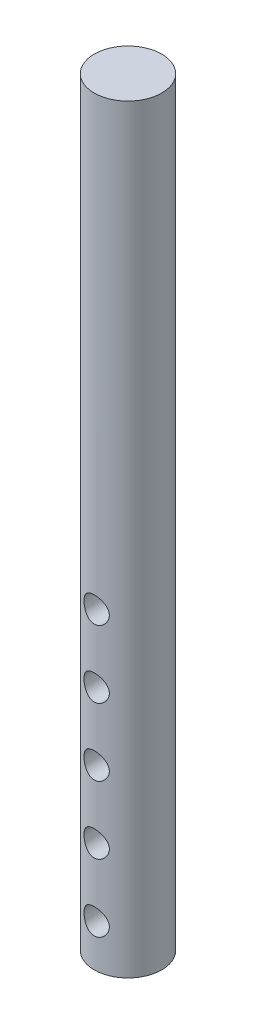
ISO-10303-21;
HEADER;
FILE_DESCRIPTION(('STEP AP214'),'2;1');
FILE_NAME('part.step','',(''),(''),'','','');
FILE_SCHEMA(('AUTOMOTIVE_DESIGN { 1 0 10303 214 1 1 1 1 }'));
ENDSEC;
DATA;
#1=APPLICATION_CONTEXT('core data for automotive mechanical design processes');
#2=APPLICATION_PROTOCOL_DEFINITION('international standard','automotive_design',2000,#1);
#3=PRODUCT_CONTEXT('',#1,'mechanical');
#4=PRODUCT('Part','Part','',(#3));
#5=PRODUCT_RELATED_PRODUCT_CATEGORY('part','',(#4));
#6=PRODUCT_DEFINITION_FORMATION('','',#4);
#7=PRODUCT_DEFINITION_CONTEXT('part definition',#1,'design');
#8=PRODUCT_DEFINITION('design','',#6,#7);
#9=PRODUCT_DEFINITION_SHAPE('','',#8);
#10=(LENGTH_UNIT() NAMED_UNIT(*) SI_UNIT(.MILLI.,.METRE.));
#11=(NAMED_UNIT(*) PLANE_ANGLE_UNIT() SI_UNIT($,.RADIAN.));
#12=(NAMED_UNIT(*) SI_UNIT($,.STERADIAN.) SOLID_ANGLE_UNIT());
#13=UNCERTAINTY_MEASURE_WITH_UNIT(LENGTH_MEASURE(1.E-05),#10,'distance_accuracy_value','');
#14=(GEOMETRIC_REPRESENTATION_CONTEXT(3) GLOBAL_UNCERTAINTY_ASSIGNED_CONTEXT((#13)) GLOBAL_UNIT_ASSIGNED_CONTEXT((#10,
#11,#12)) REPRESENTATION_CONTEXT('',''));
#15=CARTESIAN_POINT('',(0.,0.,0.));
#16=DIRECTION('',(0.,0.,1.));
#17=DIRECTION('',(1.,0.,0.));
#18=AXIS2_PLACEMENT_3D('',#15,#16,#17);
#19=CARTESIAN_POINT('',(-2.91025939558845E-06,71.2591222864222,0.0183221084520018));
#20=DIRECTION('',(0.,-1.,0.));
#21=DIRECTION('',(0.,0.,-1.));
#22=AXIS2_PLACEMENT_3D('',#19,#20,#21);
#23=CYLINDRICAL_SURFACE('',#22,3.81);
#24=CARTESIAN_POINT('',(1.42874708974061,5.53662228642216,3.55028663793131));
#25=CARTESIAN_POINT('',(1.4287499863513,5.45946265817811,3.550283935489));
#26=CARTESIAN_POINT('',(1.42247580639948,5.38232212273745,3.55284253724739));
#27=CARTESIAN_POINT('',(1.39765927944494,5.23036678744734,3.56272852583181));
#28=CARTESIAN_POINT('',(1.37911729987094,5.15555191801291,3.57005576983374));
#29=CARTESIAN_POINT('',(1.33054107848133,5.01048474496028,3.58853480812757));
#30=CARTESIAN_POINT('',(1.30053437245258,4.940221977462,3.5996774320992));
#31=CARTESIAN_POINT('',(1.22997802521481,4.80570055470221,3.62451696176985));
#32=CARTESIAN_POINT('',(1.18942521724585,4.74144371077806,3.63821463434325));
#33=CARTESIAN_POINT('',(1.09676903932951,4.61756426460142,3.66738365714291));
#34=CARTESIAN_POINT('',(1.04422647079735,4.55828236195016,3.68290719027432));
#35=CARTESIAN_POINT('',(0.93001412713004,4.44913130544757,3.71354348318891));
#36=CARTESIAN_POINT('',(0.8683424100601,4.39926415943305,3.72865615476283));
#37=CARTESIAN_POINT('',(0.735036248797277,4.30871690096059,3.75738823269767));
#38=CARTESIAN_POINT('',(0.663134207270584,4.26840713675531,3.77093932910589));
#39=CARTESIAN_POINT('',(0.51297146253751,4.20059704459218,3.7943941344029));
#40=CARTESIAN_POINT('',(0.434712975704805,4.1730922740998,3.80429910801899));
#41=CARTESIAN_POINT('',(0.277640687687794,4.13286789069684,3.81897519836226));
#42=CARTESIAN_POINT('',(0.198996435151332,4.11956172128512,3.82394932587273));
#43=CARTESIAN_POINT('',(0.0404443962551448,4.10623284252206,3.82893184283013));
#44=CARTESIAN_POINT('',(-0.0394629707817375,4.10620581374034,3.82894184700394));
#45=CARTESIAN_POINT('',(-0.194068635028302,4.11909441421774,3.8241241161866));
#46=CARTESIAN_POINT('',(-0.268829060058611,4.13136979271841,3.81953569597041));
#47=CARTESIAN_POINT('',(-0.415139765389521,4.1674377456745,3.80635055218181));
#48=CARTESIAN_POINT('',(-0.486689817976748,4.19123113570175,3.79775354476938));
#49=CARTESIAN_POINT('',(-0.625784949240595,4.2499571416434,3.77724685977273));
#50=CARTESIAN_POINT('',(-0.69325659641305,4.28504681644032,3.76529079690449));
#51=CARTESIAN_POINT('',(-0.821521404338963,4.3652302587474,3.73927583834779));
#52=CARTESIAN_POINT('',(-0.882312401287425,4.41032725334643,3.72521626481181));
#53=CARTESIAN_POINT('',(-0.999261598937279,4.5123297766069,3.69547245342365));
#54=CARTESIAN_POINT('',(-1.05494061362285,4.56977184107919,3.67974128830299));
#55=CARTESIAN_POINT('',(-1.15605592805737,4.69327211256095,3.64908504610251));
#56=CARTESIAN_POINT('',(-1.20148965535926,4.75933247694594,3.63416017218477));
#57=CARTESIAN_POINT('',(-1.28174036273203,4.9000850791805,3.6065106092927));
#58=CARTESIAN_POINT('',(-1.31629931104808,4.97493636415814,3.59384210830839));
#59=CARTESIAN_POINT('',(-1.37214073406469,5.12999644089428,3.57278958639325));
#60=CARTESIAN_POINT('',(-1.39343059652768,5.21020222386515,3.56440318181209));
#61=CARTESIAN_POINT('',(-1.42103948629398,5.36895939052811,3.55342677199964));
#62=CARTESIAN_POINT('',(-1.42811969929854,5.44735789694534,3.55054248787765));
#63=CARTESIAN_POINT('',(-1.42930427094488,5.60425869871867,3.55006389742778));
#64=CARTESIAN_POINT('',(-1.42341187217747,5.68276096323789,3.55246826916498));
#65=CARTESIAN_POINT('',(-1.39950862203888,5.83373553740118,3.56199721847523));
#66=CARTESIAN_POINT('',(-1.38208629989288,5.906317193238,3.56889231441368));
#67=CARTESIAN_POINT('',(-1.33635826371146,6.04749370376815,3.5863536475686));
#68=CARTESIAN_POINT('',(-1.30805031988917,6.11608773832981,3.5969206368849));
#69=CARTESIAN_POINT('',(-1.24016069418141,6.25020141368975,3.62102232413266));
#70=CARTESIAN_POINT('',(-1.20019620307076,6.31550943718298,3.63465341614892));
#71=CARTESIAN_POINT('',(-1.1105352128995,6.43876264151621,3.66318541460513));
#72=CARTESIAN_POINT('',(-1.06083515196793,6.49670511475212,3.67808678466059));
#73=CARTESIAN_POINT('',(-0.94938570246753,6.60739266189049,3.70862187687108));
#74=CARTESIAN_POINT('',(-0.887072200529622,6.6595754082744,3.72424214157769));
#75=CARTESIAN_POINT('',(-0.754190002104262,6.7528108315511,3.75354966747746));
#76=CARTESIAN_POINT('',(-0.683621278849232,6.79386347235307,3.76723692240251));
#77=CARTESIAN_POINT('',(-0.53627596407811,6.86340340495229,3.79112684728786));
#78=CARTESIAN_POINT('',(-0.459521707753442,6.89193370183461,3.80134141569655));
#79=CARTESIAN_POINT('',(-0.301832908125285,6.93551752061421,3.81717249313924));
#80=CARTESIAN_POINT('',(-0.220900348248608,6.950577375787,3.82279116287891));
#81=CARTESIAN_POINT('',(-0.0622350552326956,6.96610990504613,3.82859268814713));
#82=CARTESIAN_POINT('',(0.0154092713185686,6.96738156903585,3.82907325903661));
#83=CARTESIAN_POINT('',(0.169758103798447,6.95735684705042,3.82532068388486));
#84=CARTESIAN_POINT('',(0.246462721946721,6.94606197685338,3.82108810634457));
#85=CARTESIAN_POINT('',(0.394854296319826,6.91178573037449,3.80852048692792));
#86=CARTESIAN_POINT('',(0.466618011083678,6.88909617607302,3.80028804632762));
#87=CARTESIAN_POINT('',(0.6053255777792,6.83296524867355,3.78058074744193));
#88=CARTESIAN_POINT('',(0.672268514380568,6.79952184027438,3.7691052754222));
#89=CARTESIAN_POINT('',(0.802516608327791,6.72123325523383,3.74346024776021));
#90=CARTESIAN_POINT('',(0.865550555017237,6.67596788633243,3.72919772048859));
#91=CARTESIAN_POINT('',(0.983374613256615,6.57598282816846,3.69972991924539));
#92=CARTESIAN_POINT('',(1.03816176911186,6.52125976424016,3.68452431001211));
#93=CARTESIAN_POINT('',(1.14091315534038,6.40047870103024,3.65390154421764));
#94=CARTESIAN_POINT('',(1.18836466298825,6.33397489337018,3.63851557940275));
#95=CARTESIAN_POINT('',(1.27143894826954,6.19345117065357,3.61018365411165));
#96=CARTESIAN_POINT('',(1.30706049870506,6.11943047686122,3.59723794683934));
#97=CARTESIAN_POINT('',(1.36650966317044,5.96243200029308,3.57497872880436));
#98=CARTESIAN_POINT('',(1.38975176735857,5.87920380231968,3.56584933479744));
#99=CARTESIAN_POINT('',(1.42086378751842,5.70951506488427,3.5535067545054));
#100=CARTESIAN_POINT('',(1.42874384495002,5.62305669631589,3.55028966521399));
#101=CARTESIAN_POINT('',(1.42874708974061,5.53662228642216,3.55028663793131));
#102=B_SPLINE_CURVE_WITH_KNOTS('',3,(#24,#25,#26,#27,#28,#29,#30,#31,#32,#33,#34,#35,#36,#37,
#38,#39,#40,#41,#42,#43,#44,#45,#46,#47,#48,#49,#50,#51,#52,#53,#54,#55,#56,#57,#58,#59,#60,#61,
#62,#63,#64,#65,#66,#67,#68,#69,#70,#71,#72,#73,#74,#75,#76,#77,#78,#79,#80,#81,#82,#83,#84,#85,
#86,#87,#88,#89,#90,#91,#92,#93,#94,#95,#96,#97,#98,#99,#100,#101),.UNSPECIFIED.,.T.,.F.,(4,2,2,
2,2,2,2,2,2,2,2,2,2,2,2,2,2,2,2,2,2,2,2,2,2,2,2,2,2,2,2,2,2,2,2,2,2,2,4),(0.,0.231157025698902,
0.462307128405409,0.692905513561072,0.923573222397995,1.16466606412074,1.40581026453891,
1.65515993709941,1.90442303628217,2.14293467611419,2.38136873298127,2.60800665345043,
2.83466062413327,3.06461284978161,3.29463933681599,3.53812483000246,3.78167139105536,
4.03062369120951,4.27943725932789,4.51452288997812,4.74954976607912,4.97342013246609,
5.19733638041624,5.42964586858045,5.66204050914203,5.90916728686427,6.15629486591794,
6.40256697217885,6.64872322996021,6.88053348823814,7.11231578854304,7.33844360988706,
7.56461425395971,7.8002922830233,8.03605458027454,8.2842601606383,8.53249148093391,
8.79160527874557,9.05054796112708),.UNSPECIFIED.);
#103=CARTESIAN_POINT('',(1.42874708974061,5.53662228642216,3.55028663793131));
#104=VERTEX_POINT('',#103);
#105=EDGE_CURVE('E10',#104,#104,#102,.T.);
#106=ORIENTED_EDGE('',*,*,#105,.T.);
#107=EDGE_LOOP('',(#106));
#108=FACE_BOUND('',#107,.T.);
#109=CARTESIAN_POINT('',(1.42874708974061,-2.08337771357784,3.55028663793131));
#110=CARTESIAN_POINT('',(1.4287499863513,-2.16053734182189,3.550283935489));
#111=CARTESIAN_POINT('',(1.42247580639948,-2.23767787726255,3.55284253724739));
#112=CARTESIAN_POINT('',(1.39765927944494,-2.38963321255266,3.56272852583181));
#113=CARTESIAN_POINT('',(1.37911729987095,-2.46444808198709,3.57005576983374));
#114=CARTESIAN_POINT('',(1.33054107848133,-2.60951525503972,3.58853480812757));
#115=CARTESIAN_POINT('',(1.30053437245258,-2.679778022538,3.5996774320992));
#116=CARTESIAN_POINT('',(1.22997802521481,-2.81429944529778,3.62451696176985));
#117=CARTESIAN_POINT('',(1.18942521724586,-2.87855628922194,3.63821463434325));
#118=CARTESIAN_POINT('',(1.09676903932951,-3.00243573539857,3.66738365714291));
#119=CARTESIAN_POINT('',(1.04422647079736,-3.06171763804984,3.68290719027432));
#120=CARTESIAN_POINT('',(0.930014127130041,-3.17086869455243,3.71354348318891));
#121=CARTESIAN_POINT('',(0.868342410060101,-3.22073584056696,3.72865615476283));
#122=CARTESIAN_POINT('',(0.735036248797278,-3.31128309903941,3.75738823269767));
#123=CARTESIAN_POINT('',(0.663134207270585,-3.35159286324469,3.77093932910589));
#124=CARTESIAN_POINT('',(0.512971462537512,-3.41940295540782,3.7943941344029));
#125=CARTESIAN_POINT('',(0.434712975704807,-3.4469077259002,3.80429910801899));
#126=CARTESIAN_POINT('',(0.277640687687796,-3.48713210930316,3.81897519836226));
#127=CARTESIAN_POINT('',(0.198996435151334,-3.50043827871487,3.82394932587273));
#128=CARTESIAN_POINT('',(0.0404443962551471,-3.51376715747794,3.82893184283013));
#129=CARTESIAN_POINT('',(-0.0394629707817352,-3.51379418625966,3.82894184700394));
#130=CARTESIAN_POINT('',(-0.1940686350283,-3.50090558578226,3.8241241161866));
#131=CARTESIAN_POINT('',(-0.268829060058609,-3.48863020728159,3.81953569597041));
#132=CARTESIAN_POINT('',(-0.41513976538952,-3.4525622543255,3.80635055218181));
#133=CARTESIAN_POINT('',(-0.486689817976746,-3.42876886429825,3.79775354476938));
#134=CARTESIAN_POINT('',(-0.625784949240594,-3.37004285835659,3.77724685977273));
#135=CARTESIAN_POINT('',(-0.693256596413049,-3.33495318355968,3.76529079690449));
#136=CARTESIAN_POINT('',(-0.821521404338963,-3.2547697412526,3.73927583834779));
#137=CARTESIAN_POINT('',(-0.882312401287425,-3.20967274665357,3.72521626481181));
#138=CARTESIAN_POINT('',(-0.999261598937278,-3.1076702233931,3.69547245342365));
#139=CARTESIAN_POINT('',(-1.05494061362285,-3.05022815892081,3.67974128830299));
#140=CARTESIAN_POINT('',(-1.15605592805737,-2.92672788743905,3.64908504610251));
#141=CARTESIAN_POINT('',(-1.20148965535926,-2.86066752305406,3.63416017218477));
#142=CARTESIAN_POINT('',(-1.28174036273203,-2.7199149208195,3.6065106092927));
#143=CARTESIAN_POINT('',(-1.31629931104807,-2.64506363584186,3.59384210830839));
#144=CARTESIAN_POINT('',(-1.37214073406468,-2.49000355910573,3.57278958639325));
#145=CARTESIAN_POINT('',(-1.39343059652768,-2.40979777613485,3.56440318181209));
#146=CARTESIAN_POINT('',(-1.42103948629398,-2.25104060947189,3.55342677199964));
#147=CARTESIAN_POINT('',(-1.42811969929854,-2.17264210305466,3.55054248787765));
#148=CARTESIAN_POINT('',(-1.42930427094488,-2.01574130128133,3.55006389742778));
#149=CARTESIAN_POINT('',(-1.42341187217747,-1.93723903676211,3.55246826916498));
#150=CARTESIAN_POINT('',(-1.39950862203888,-1.78626446259882,3.56199721847523));
#151=CARTESIAN_POINT('',(-1.38208629989287,-1.713682806762,3.56889231441368));
#152=CARTESIAN_POINT('',(-1.33635826371146,-1.57250629623185,3.5863536475686));
#153=CARTESIAN_POINT('',(-1.30805031988917,-1.50391226167019,3.5969206368849));
#154=CARTESIAN_POINT('',(-1.24016069418141,-1.36979858631025,3.62102232413266));
#155=CARTESIAN_POINT('',(-1.20019620307076,-1.30449056281702,3.63465341614892));
#156=CARTESIAN_POINT('',(-1.1105352128995,-1.18123735848379,3.66318541460513));
#157=CARTESIAN_POINT('',(-1.06083515196793,-1.12329488524788,3.67808678466059));
#158=CARTESIAN_POINT('',(-0.949385702467529,-1.01260733810951,3.70862187687108));
#159=CARTESIAN_POINT('',(-0.887072200529622,-0.960424591725603,3.72424214157769));
#160=CARTESIAN_POINT('',(-0.754190002104262,-0.867189168448899,3.75354966747746));
#161=CARTESIAN_POINT('',(-0.683621278849232,-0.826136527646928,3.76723692240251));
#162=CARTESIAN_POINT('',(-0.536275964078111,-0.756596595047709,3.79112684728786));
#163=CARTESIAN_POINT('',(-0.459521707753443,-0.728066298165385,3.80134141569655));
#164=CARTESIAN_POINT('',(-0.301832908125286,-0.684482479385792,3.81717249313924));
#165=CARTESIAN_POINT('',(-0.220900348248608,-0.669422624213004,3.82279116287891));
#166=CARTESIAN_POINT('',(-0.0622350552326949,-0.653890094953869,3.82859268814713));
#167=CARTESIAN_POINT('',(0.0154092713185693,-0.652618430964151,3.82907325903661));
#168=CARTESIAN_POINT('',(0.169758103798448,-0.662643152949577,3.82532068388486));
#169=CARTESIAN_POINT('',(0.246462721946722,-0.673938023146617,3.82108810634457));
#170=CARTESIAN_POINT('',(0.394854296319827,-0.708214269625513,3.80852048692792));
#171=CARTESIAN_POINT('',(0.466618011083679,-0.730903823926974,3.80028804632762));
#172=CARTESIAN_POINT('',(0.6053255777792,-0.787034751326445,3.78058074744193));
#173=CARTESIAN_POINT('',(0.672268514380568,-0.820478159725617,3.7691052754222));
#174=CARTESIAN_POINT('',(0.802516608327792,-0.898766744766172,3.74346024776021));
#175=CARTESIAN_POINT('',(0.865550555017239,-0.944032113667565,3.72919772048859));
#176=CARTESIAN_POINT('',(0.983374613256616,-1.04401717183153,3.69972991924539));
#177=CARTESIAN_POINT('',(1.03816176911186,-1.09874023575984,3.68452431001211));
#178=CARTESIAN_POINT('',(1.14091315534038,-1.21952129896976,3.65390154421764));
#179=CARTESIAN_POINT('',(1.18836466298825,-1.28602510662982,3.63851557940275));
#180=CARTESIAN_POINT('',(1.27143894826955,-1.42654882934643,3.61018365411165));
#181=CARTESIAN_POINT('',(1.30706049870506,-1.50056952313878,3.59723794683934));
#182=CARTESIAN_POINT('',(1.36650966317044,-1.65756799970692,3.57497872880436));
#183=CARTESIAN_POINT('',(1.38975176735857,-1.74079619768032,3.56584933479744));
#184=CARTESIAN_POINT('',(1.42086378751842,-1.91048493511573,3.5535067545054));
#185=CARTESIAN_POINT('',(1.42874384495002,-1.99694330368411,3.55028966521399));
#186=CARTESIAN_POINT('',(1.42874708974061,-2.08337771357784,3.55028663793131));
#187=B_SPLINE_CURVE_WITH_KNOTS('',3,(#109,#110,#111,#112,#113,#114,#115,#116,#117,#118,#119,
#120,#121,#122,#123,#124,#125,#126,#127,#128,#129,#130,#131,#132,#133,#134,#135,#136,#137,#138,
#139,#140,#141,#142,#143,#144,#145,#146,#147,#148,#149,#150,#151,#152,#153,#154,#155,#156,#157,
#158,#159,#160,#161,#162,#163,#164,#165,#166,#167,#168,#169,#170,#171,#172,#173,#174,#175,#176,
#177,#178,#179,#180,#181,#182,#183,#184,#185,#186),.UNSPECIFIED.,.T.,.F.,(4,2,2,2,2,2,2,2,2,2,2,
2,2,2,2,2,2,2,2,2,2,2,2,2,2,2,2,2,2,2,2,2,2,2,2,2,2,2,4),(0.,0.231157025698902,
0.462307128405409,0.692905513561071,0.923573222397994,1.16466606412074,1.40581026453891,
1.65515993709941,1.90442303628217,2.14293467611419,2.38136873298126,2.60800665345042,
2.83466062413327,3.06461284978161,3.29463933681599,3.53812483000245,3.78167139105536,
4.0306236912095,4.27943725932789,4.51452288997812,4.74954976607912,4.97342013246609,
5.19733638041624,5.42964586858045,5.66204050914203,5.90916728686427,6.15629486591794,
6.40256697217885,6.64872322996021,6.88053348823814,7.11231578854304,7.33844360988706,
7.56461425395971,7.8002922830233,8.03605458027453,8.2842601606383,8.53249148093391,
8.79160527874557,9.05054796112708),.UNSPECIFIED.);
#188=CARTESIAN_POINT('',(1.42874708974061,-2.08337771357784,3.55028663793131));
#189=VERTEX_POINT('',#188);
#190=EDGE_CURVE('E42',#189,#189,#187,.T.);
#191=ORIENTED_EDGE('',*,*,#190,.T.);
#192=EDGE_LOOP('',(#191));
#193=FACE_BOUND('',#192,.T.);
#194=CARTESIAN_POINT('',(1.42874708974061,20.7766222864222,3.55028663793131));
#195=CARTESIAN_POINT('',(1.4287499863513,20.6994626581781,3.550283935489));
#196=CARTESIAN_POINT('',(1.42247580639948,20.6223221227375,3.55284253724739));
#197=CARTESIAN_POINT('',(1.39765927944494,20.4703667874473,3.56272852583181));
#198=CARTESIAN_POINT('',(1.37911729987094,20.3955519180129,3.57005576983374));
#199=CARTESIAN_POINT('',(1.33054107848133,20.2504847449603,3.58853480812757));
#200=CARTESIAN_POINT('',(1.30053437245258,20.180221977462,3.5996774320992));
#201=CARTESIAN_POINT('',(1.22997802521481,20.0457005547022,3.62451696176985));
#202=CARTESIAN_POINT('',(1.18942521724585,19.9814437107781,3.63821463434325));
#203=CARTESIAN_POINT('',(1.09676903932951,19.8575642646014,3.66738365714291));
#204=CARTESIAN_POINT('',(1.04422647079736,19.7982823619502,3.68290719027432));
#205=CARTESIAN_POINT('',(0.930014127130042,19.6891313054476,3.71354348318891));
#206=CARTESIAN_POINT('',(0.868342410060102,19.6392641594331,3.72865615476282));
#207=CARTESIAN_POINT('',(0.735036248797279,19.5487169009606,3.75738823269767));
#208=CARTESIAN_POINT('',(0.663134207270587,19.5084071367553,3.77093932910589));
#209=CARTESIAN_POINT('',(0.512971462537514,19.4405970445922,3.7943941344029));
#210=CARTESIAN_POINT('',(0.434712975704809,19.4130922740998,3.80429910801899));
#211=CARTESIAN_POINT('',(0.277640687687799,19.3728678906968,3.81897519836226));
#212=CARTESIAN_POINT('',(0.198996435151336,19.3595617212851,3.82394932587273));
#213=CARTESIAN_POINT('',(0.0404443962551484,19.3462328425221,3.82893184283013));
#214=CARTESIAN_POINT('',(-0.0394629707817344,19.3462058137403,3.82894184700394));
#215=CARTESIAN_POINT('',(-0.194068635028299,19.3590944142177,3.8241241161866));
#216=CARTESIAN_POINT('',(-0.268829060058608,19.3713697927184,3.81953569597041));
#217=CARTESIAN_POINT('',(-0.415139765389518,19.4074377456745,3.80635055218181));
#218=CARTESIAN_POINT('',(-0.486689817976746,19.4312311357018,3.79775354476938));
#219=CARTESIAN_POINT('',(-0.625784949240593,19.4899571416434,3.77724685977273));
#220=CARTESIAN_POINT('',(-0.693256596413047,19.5250468164403,3.76529079690449));
#221=CARTESIAN_POINT('',(-0.82152140433896,19.6052302587474,3.73927583834779));
#222=CARTESIAN_POINT('',(-0.882312401287423,19.6503272533464,3.72521626481181));
#223=CARTESIAN_POINT('',(-0.999261598937278,19.7523297766069,3.69547245342365));
#224=CARTESIAN_POINT('',(-1.05494061362285,19.8097718410792,3.67974128830299));
#225=CARTESIAN_POINT('',(-1.15605592805737,19.9332721125609,3.64908504610251));
#226=CARTESIAN_POINT('',(-1.20148965535926,19.9993324769459,3.63416017218477));
#227=CARTESIAN_POINT('',(-1.28174036273203,20.1400850791805,3.6065106092927));
#228=CARTESIAN_POINT('',(-1.31629931104808,20.2149363641581,3.59384210830839));
#229=CARTESIAN_POINT('',(-1.37214073406469,20.3699964408943,3.57278958639325));
#230=CARTESIAN_POINT('',(-1.39343059652768,20.4502022238651,3.56440318181209));
#231=CARTESIAN_POINT('',(-1.42103948629398,20.6089593905281,3.55342677199964));
#232=CARTESIAN_POINT('',(-1.42811969929854,20.6873578969453,3.55054248787764));
#233=CARTESIAN_POINT('',(-1.42930427094488,20.8442586987187,3.55006389742778));
#234=CARTESIAN_POINT('',(-1.42341187217747,20.9227609632379,3.55246826916498));
#235=CARTESIAN_POINT('',(-1.39950862203888,21.0737355374012,3.56199721847523));
#236=CARTESIAN_POINT('',(-1.38208629989288,21.146317193238,3.56889231441368));
#237=CARTESIAN_POINT('',(-1.33635826371146,21.2874937037681,3.5863536475686));
#238=CARTESIAN_POINT('',(-1.30805031988917,21.3560877383298,3.5969206368849));
#239=CARTESIAN_POINT('',(-1.24016069418141,21.4902014136897,3.62102232413266));
#240=CARTESIAN_POINT('',(-1.20019620307076,21.555509437183,3.63465341614892));
#241=CARTESIAN_POINT('',(-1.1105352128995,21.6787626415162,3.66318541460513));
#242=CARTESIAN_POINT('',(-1.06083515196793,21.7367051147521,3.67808678466059));
#243=CARTESIAN_POINT('',(-0.949385702467534,21.8473926618905,3.70862187687108));
#244=CARTESIAN_POINT('',(-0.887072200529627,21.8995754082744,3.72424214157769));
#245=CARTESIAN_POINT('',(-0.754190002104268,21.9928108315511,3.75354966747746));
#246=CARTESIAN_POINT('',(-0.683621278849239,22.0338634723531,3.7672369224025));
#247=CARTESIAN_POINT('',(-0.536275964078118,22.1034034049523,3.79112684728786));
#248=CARTESIAN_POINT('',(-0.459521707753451,22.1319337018346,3.80134141569655));
#249=CARTESIAN_POINT('',(-0.301832908125294,22.1755175206142,3.81717249313924));
#250=CARTESIAN_POINT('',(-0.220900348248615,22.190577375787,3.82279116287891));
#251=CARTESIAN_POINT('',(-0.0622350552327017,22.2061099050461,3.82859268814713));
#252=CARTESIAN_POINT('',(0.0154092713185628,22.2073815690359,3.82907325903661));
#253=CARTESIAN_POINT('',(0.169758103798441,22.1973568470504,3.82532068388486));
#254=CARTESIAN_POINT('',(0.246462721946715,22.1860619768534,3.82108810634457));
#255=CARTESIAN_POINT('',(0.394854296319821,22.1517857303745,3.80852048692792));
#256=CARTESIAN_POINT('',(0.466618011083674,22.129096176073,3.80028804632762));
#257=CARTESIAN_POINT('',(0.605325577779195,22.0729652486736,3.78058074744193));
#258=CARTESIAN_POINT('',(0.672268514380563,22.0395218402744,3.7691052754222));
#259=CARTESIAN_POINT('',(0.802516608327787,21.9612332552338,3.74346024776021));
#260=CARTESIAN_POINT('',(0.865550555017234,21.9159678863324,3.72919772048859));
#261=CARTESIAN_POINT('',(0.983374613256612,21.8159828281685,3.69972991924539));
#262=CARTESIAN_POINT('',(1.03816176911185,21.7612597642402,3.68452431001211));
#263=CARTESIAN_POINT('',(1.14091315534037,21.6404787010302,3.65390154421764));
#264=CARTESIAN_POINT('',(1.18836466298825,21.5739748933702,3.63851557940275));
#265=CARTESIAN_POINT('',(1.27143894826954,21.4334511706536,3.61018365411165));
#266=CARTESIAN_POINT('',(1.30706049870505,21.3594304768612,3.59723794683934));
#267=CARTESIAN_POINT('',(1.36650966317044,21.2024320002931,3.57497872880436));
#268=CARTESIAN_POINT('',(1.38975176735856,21.1192038023197,3.56584933479744));
#269=CARTESIAN_POINT('',(1.42086378751841,20.9495150648843,3.5535067545054));
#270=CARTESIAN_POINT('',(1.42874384495002,20.8630566963159,3.55028966521399));
#271=CARTESIAN_POINT('',(1.42874708974061,20.7766222864222,3.55028663793131));
#272=B_SPLINE_CURVE_WITH_KNOTS('',3,(#194,#195,#196,#197,#198,#199,#200,#201,#202,#203,#204,
#205,#206,#207,#208,#209,#210,#211,#212,#213,#214,#215,#216,#217,#218,#219,#220,#221,#222,#223,
#224,#225,#226,#227,#228,#229,#230,#231,#232,#233,#234,#235,#236,#237,#238,#239,#240,#241,#242,
#243,#244,#245,#246,#247,#248,#249,#250,#251,#252,#253,#254,#255,#256,#257,#258,#259,#260,#261,
#262,#263,#264,#265,#266,#267,#268,#269,#270,#271),.UNSPECIFIED.,.T.,.F.,(4,2,2,2,2,2,2,2,2,2,2,
2,2,2,2,2,2,2,2,2,2,2,2,2,2,2,2,2,2,2,2,2,2,2,2,2,2,2,4),(0.,0.231157025698903,
0.462307128405408,0.692905513561069,0.923573222397987,1.16466606412074,1.40581026453891,
1.65515993709941,1.90442303628216,2.14293467611419,2.38136873298126,2.60800665345042,
2.83466062413327,3.06461284978161,3.29463933681599,3.53812483000245,3.78167139105536,
4.0306236912095,4.27943725932789,4.51452288997812,4.74954976607912,4.97342013246609,
5.19733638041624,5.42964586858045,5.66204050914203,5.90916728686427,6.15629486591794,
6.40256697217885,6.64872322996021,6.88053348823814,7.11231578854304,7.33844360988706,
7.56461425395972,7.8002922830233,8.03605458027454,8.2842601606383,8.53249148093391,
8.79160527874558,9.05054796112708),.UNSPECIFIED.);
#273=CARTESIAN_POINT('',(1.42874708974061,20.7766222864222,3.55028663793131));
#274=VERTEX_POINT('',#273);
#275=EDGE_CURVE('E46',#274,#274,#272,.T.);
#276=ORIENTED_EDGE('',*,*,#275,.T.);
#277=EDGE_LOOP('',(#276));
#278=FACE_BOUND('',#277,.T.);
#279=CARTESIAN_POINT('',(1.42874708974061,-9.70337771357784,3.55028663793131));
#280=CARTESIAN_POINT('',(1.4287499863513,-9.78053734182189,3.550283935489));
#281=CARTESIAN_POINT('',(1.42247580639948,-9.85767787726255,3.55284253724739));
#282=CARTESIAN_POINT('',(1.39765927944495,-10.0096332125527,3.56272852583181));
#283=CARTESIAN_POINT('',(1.37911729987095,-10.0844480819871,3.57005576983374));
#284=CARTESIAN_POINT('',(1.33054107848133,-10.2295152550397,3.58853480812757));
#285=CARTESIAN_POINT('',(1.30053437245258,-10.299778022538,3.5996774320992));
#286=CARTESIAN_POINT('',(1.22997802521481,-10.4342994452978,3.62451696176985));
#287=CARTESIAN_POINT('',(1.18942521724586,-10.4985562892219,3.63821463434325));
#288=CARTESIAN_POINT('',(1.09676903932951,-10.6224357353986,3.66738365714291));
#289=CARTESIAN_POINT('',(1.04422647079736,-10.6817176380498,3.68290719027432));
#290=CARTESIAN_POINT('',(0.930014127130042,-10.7908686945524,3.71354348318891));
#291=CARTESIAN_POINT('',(0.868342410060102,-10.840735840567,3.72865615476282));
#292=CARTESIAN_POINT('',(0.735036248797279,-10.9312830990394,3.75738823269767));
#293=CARTESIAN_POINT('',(0.663134207270587,-10.9715928632447,3.77093932910589));
#294=CARTESIAN_POINT('',(0.512971462537513,-11.0394029554078,3.7943941344029));
#295=CARTESIAN_POINT('',(0.434712975704808,-11.0669077259002,3.80429910801899));
#296=CARTESIAN_POINT('',(0.277640687687797,-11.1071321093032,3.81897519836226));
#297=CARTESIAN_POINT('',(0.198996435151335,-11.1204382787149,3.82394932587273));
#298=CARTESIAN_POINT('',(0.0404443962551486,-11.1337671574779,3.82893184283013));
#299=CARTESIAN_POINT('',(-0.0394629707817336,-11.1337941862597,3.82894184700394));
#300=CARTESIAN_POINT('',(-0.194068635028299,-11.1209055857823,3.8241241161866));
#301=CARTESIAN_POINT('',(-0.268829060058607,-11.1086302072816,3.81953569597041));
#302=CARTESIAN_POINT('',(-0.415139765389518,-11.0725622543255,3.80635055218181));
#303=CARTESIAN_POINT('',(-0.486689817976745,-11.0487688642982,3.79775354476938));
#304=CARTESIAN_POINT('',(-0.625784949240592,-10.9900428583566,3.77724685977273));
#305=CARTESIAN_POINT('',(-0.693256596413048,-10.9549531835597,3.76529079690449));
#306=CARTESIAN_POINT('',(-0.821521404338961,-10.8747697412526,3.73927583834779));
#307=CARTESIAN_POINT('',(-0.882312401287423,-10.8296727466536,3.72521626481181));
#308=CARTESIAN_POINT('',(-0.999261598937277,-10.7276702233931,3.69547245342365));
#309=CARTESIAN_POINT('',(-1.05494061362285,-10.6702281589208,3.67974128830299));
#310=CARTESIAN_POINT('',(-1.15605592805737,-10.5467278874391,3.64908504610251));
#311=CARTESIAN_POINT('',(-1.20148965535926,-10.4806675230541,3.63416017218477));
#312=CARTESIAN_POINT('',(-1.28174036273203,-10.3399149208195,3.6065106092927));
#313=CARTESIAN_POINT('',(-1.31629931104807,-10.2650636358419,3.59384210830839));
#314=CARTESIAN_POINT('',(-1.37214073406468,-10.1100035591057,3.57278958639325));
#315=CARTESIAN_POINT('',(-1.39343059652768,-10.0297977761348,3.56440318181209));
#316=CARTESIAN_POINT('',(-1.42103948629398,-9.87104060947189,3.55342677199964));
#317=CARTESIAN_POINT('',(-1.42811969929854,-9.79264210305467,3.55054248787765));
#318=CARTESIAN_POINT('',(-1.42930427094488,-9.63574130128133,3.55006389742778));
#319=CARTESIAN_POINT('',(-1.42341187217747,-9.55723903676211,3.55246826916498));
#320=CARTESIAN_POINT('',(-1.39950862203888,-9.40626446259883,3.56199721847523));
#321=CARTESIAN_POINT('',(-1.38208629989287,-9.333682806762,3.56889231441368));
#322=CARTESIAN_POINT('',(-1.33635826371146,-9.19250629623186,3.5863536475686));
#323=CARTESIAN_POINT('',(-1.30805031988917,-9.12391226167019,3.5969206368849));
#324=CARTESIAN_POINT('',(-1.24016069418141,-8.98979858631025,3.62102232413266));
#325=CARTESIAN_POINT('',(-1.20019620307076,-8.92449056281702,3.63465341614892));
#326=CARTESIAN_POINT('',(-1.1105352128995,-8.80123735848379,3.66318541460513));
#327=CARTESIAN_POINT('',(-1.06083515196792,-8.74329488524788,3.67808678466059));
#328=CARTESIAN_POINT('',(-0.949385702467528,-8.63260733810951,3.70862187687108));
#329=CARTESIAN_POINT('',(-0.887072200529621,-8.5804245917256,3.72424214157769));
#330=CARTESIAN_POINT('',(-0.754190002104261,-8.4871891684489,3.75354966747746));
#331=CARTESIAN_POINT('',(-0.683621278849232,-8.44613652764693,3.76723692240251));
#332=CARTESIAN_POINT('',(-0.53627596407811,-8.37659659504771,3.79112684728786));
#333=CARTESIAN_POINT('',(-0.459521707753443,-8.34806629816539,3.80134141569655));
#334=CARTESIAN_POINT('',(-0.301832908125286,-8.30448247938579,3.81717249313924));
#335=CARTESIAN_POINT('',(-0.220900348248608,-8.289422624213,3.82279116287891));
#336=CARTESIAN_POINT('',(-0.0622350552326954,-8.27389009495387,3.82859268814713));
#337=CARTESIAN_POINT('',(0.0154092713185692,-8.27261843096415,3.82907325903661));
#338=CARTESIAN_POINT('',(0.169758103798448,-8.28264315294958,3.82532068388485));
#339=CARTESIAN_POINT('',(0.246462721946721,-8.29393802314662,3.82108810634457));
#340=CARTESIAN_POINT('',(0.394854296319827,-8.32821426962551,3.80852048692792));
#341=CARTESIAN_POINT('',(0.466618011083679,-8.35090382392698,3.80028804632762));
#342=CARTESIAN_POINT('',(0.605325577779201,-8.40703475132645,3.78058074744193));
#343=CARTESIAN_POINT('',(0.672268514380568,-8.44047815972562,3.7691052754222));
#344=CARTESIAN_POINT('',(0.802516608327792,-8.51876674476618,3.74346024776021));
#345=CARTESIAN_POINT('',(0.865550555017239,-8.56403211366757,3.72919772048859));
#346=CARTESIAN_POINT('',(0.983374613256616,-8.66401717183154,3.69972991924539));
#347=CARTESIAN_POINT('',(1.03816176911186,-8.71874023575984,3.68452431001211));
#348=CARTESIAN_POINT('',(1.14091315534038,-8.83952129896976,3.65390154421764));
#349=CARTESIAN_POINT('',(1.18836466298825,-8.90602510662982,3.63851557940275));
#350=CARTESIAN_POINT('',(1.27143894826955,-9.04654882934643,3.61018365411165));
#351=CARTESIAN_POINT('',(1.30706049870506,-9.12056952313878,3.59723794683933));
#352=CARTESIAN_POINT('',(1.36650966317044,-9.27756799970691,3.57497872880436));
#353=CARTESIAN_POINT('',(1.38975176735857,-9.36079619768031,3.56584933479744));
#354=CARTESIAN_POINT('',(1.42086378751842,-9.53048493511573,3.5535067545054));
#355=CARTESIAN_POINT('',(1.42874384495002,-9.61694330368411,3.55028966521399));
#356=CARTESIAN_POINT('',(1.42874708974061,-9.70337771357784,3.55028663793131));
#357=B_SPLINE_CURVE_WITH_KNOTS('',3,(#279,#280,#281,#282,#283,#284,#285,#286,#287,#288,#289,
#290,#291,#292,#293,#294,#295,#296,#297,#298,#299,#300,#301,#302,#303,#304,#305,#306,#307,#308,
#309,#310,#311,#312,#313,#314,#315,#316,#317,#318,#319,#320,#321,#322,#323,#324,#325,#326,#327,
#328,#329,#330,#331,#332,#333,#334,#335,#336,#337,#338,#339,#340,#341,#342,#343,#344,#345,#346,
#347,#348,#349,#350,#351,#352,#353,#354,#355,#356),.UNSPECIFIED.,.T.,.F.,(4,2,2,2,2,2,2,2,2,2,2,
2,2,2,2,2,2,2,2,2,2,2,2,2,2,2,2,2,2,2,2,2,2,2,2,2,2,2,4),(0.,0.231157025698901,
0.462307128405406,0.692905513561068,0.923573222397993,1.16466606412074,1.40581026453891,
1.65515993709941,1.90442303628217,2.14293467611419,2.38136873298126,2.60800665345042,
2.83466062413327,3.06461284978161,3.29463933681599,3.53812483000246,3.78167139105536,
4.0306236912095,4.27943725932789,4.51452288997812,4.74954976607912,4.97342013246609,
5.19733638041623,5.42964586858045,5.66204050914203,5.90916728686427,6.15629486591794,
6.40256697217885,6.6487232299602,6.88053348823814,7.11231578854304,7.33844360988705,
7.56461425395971,7.8002922830233,8.03605458027453,8.2842601606383,8.5324914809339,
8.79160527874557,9.05054796112708),.UNSPECIFIED.);
#358=CARTESIAN_POINT('',(1.42874708974061,-9.70337771357784,3.55028663793131));
#359=VERTEX_POINT('',#358);
#360=EDGE_CURVE('E50',#359,#359,#357,.T.);
#361=ORIENTED_EDGE('',*,*,#360,.T.);
#362=EDGE_LOOP('',(#361));
#363=FACE_BOUND('',#362,.T.);
#364=CARTESIAN_POINT('',(1.42874708974061,13.1566222864222,3.55028663793131));
#365=CARTESIAN_POINT('',(1.4287499863513,13.0794626581781,3.550283935489));
#366=CARTESIAN_POINT('',(1.42247580639948,13.0023221227374,3.55284253724739));
#367=CARTESIAN_POINT('',(1.39765927944494,12.8503667874473,3.56272852583181));
#368=CARTESIAN_POINT('',(1.37911729987094,12.7755519180129,3.57005576983374));
#369=CARTESIAN_POINT('',(1.33054107848133,12.6304847449603,3.58853480812757));
#370=CARTESIAN_POINT('',(1.30053437245258,12.560221977462,3.5996774320992));
#371=CARTESIAN_POINT('',(1.22997802521481,12.4257005547022,3.62451696176985));
#372=CARTESIAN_POINT('',(1.18942521724586,12.3614437107781,3.63821463434325));
#373=CARTESIAN_POINT('',(1.09676903932951,12.2375642646014,3.66738365714291));
#374=CARTESIAN_POINT('',(1.04422647079736,12.1782823619502,3.68290719027432));
#375=CARTESIAN_POINT('',(0.930014127130043,12.0691313054476,3.71354348318891));
#376=CARTESIAN_POINT('',(0.868342410060103,12.019264159433,3.72865615476282));
#377=CARTESIAN_POINT('',(0.73503624879728,11.9287169009606,3.75738823269767));
#378=CARTESIAN_POINT('',(0.663134207270588,11.8884071367553,3.77093932910589));
#379=CARTESIAN_POINT('',(0.512971462537515,11.8205970445922,3.7943941344029));
#380=CARTESIAN_POINT('',(0.43471297570481,11.7930922740998,3.80429910801899));
#381=CARTESIAN_POINT('',(0.2776406876878,11.7528678906968,3.81897519836226));
#382=CARTESIAN_POINT('',(0.198996435151337,11.7395617212851,3.82394932587273));
#383=CARTESIAN_POINT('',(0.0404443962551494,11.7262328425221,3.82893184283013));
#384=CARTESIAN_POINT('',(-0.0394629707817331,11.7262058137403,3.82894184700394));
#385=CARTESIAN_POINT('',(-0.194068635028298,11.7390944142177,3.8241241161866));
#386=CARTESIAN_POINT('',(-0.268829060058607,11.7513697927184,3.81953569597041));
#387=CARTESIAN_POINT('',(-0.415139765389517,11.7874377456745,3.80635055218181));
#388=CARTESIAN_POINT('',(-0.486689817976744,11.8112311357018,3.79775354476938));
#389=CARTESIAN_POINT('',(-0.625784949240592,11.8699571416434,3.77724685977273));
#390=CARTESIAN_POINT('',(-0.693256596413046,11.9050468164403,3.76529079690449));
#391=CARTESIAN_POINT('',(-0.82152140433896,11.9852302587474,3.73927583834779));
#392=CARTESIAN_POINT('',(-0.882312401287422,12.0303272533464,3.72521626481181));
#393=CARTESIAN_POINT('',(-0.999261598937277,12.1323297766069,3.69547245342365));
#394=CARTESIAN_POINT('',(-1.05494061362285,12.1897718410792,3.67974128830299));
#395=CARTESIAN_POINT('',(-1.15605592805737,12.3132721125609,3.64908504610251));
#396=CARTESIAN_POINT('',(-1.20148965535926,12.3793324769459,3.63416017218477));
#397=CARTESIAN_POINT('',(-1.28174036273203,12.5200850791805,3.6065106092927));
#398=CARTESIAN_POINT('',(-1.31629931104808,12.5949363641581,3.59384210830839));
#399=CARTESIAN_POINT('',(-1.37214073406469,12.7499964408943,3.57278958639325));
#400=CARTESIAN_POINT('',(-1.39343059652768,12.8302022238651,3.56440318181209));
#401=CARTESIAN_POINT('',(-1.42103948629398,12.9889593905281,3.55342677199964));
#402=CARTESIAN_POINT('',(-1.42811969929854,13.0673578969453,3.55054248787764));
#403=CARTESIAN_POINT('',(-1.42930427094488,13.2242586987187,3.55006389742778));
#404=CARTESIAN_POINT('',(-1.42341187217747,13.3027609632379,3.55246826916498));
#405=CARTESIAN_POINT('',(-1.39950862203888,13.4537355374012,3.56199721847523));
#406=CARTESIAN_POINT('',(-1.38208629989288,13.526317193238,3.56889231441368));
#407=CARTESIAN_POINT('',(-1.33635826371146,13.6674937037681,3.5863536475686));
#408=CARTESIAN_POINT('',(-1.30805031988917,13.7360877383298,3.5969206368849));
#409=CARTESIAN_POINT('',(-1.24016069418141,13.8702014136897,3.62102232413266));
#410=CARTESIAN_POINT('',(-1.20019620307076,13.935509437183,3.63465341614892));
#411=CARTESIAN_POINT('',(-1.11053521289951,14.0587626415162,3.66318541460513));
#412=CARTESIAN_POINT('',(-1.06083515196793,14.1167051147521,3.67808678466059));
#413=CARTESIAN_POINT('',(-0.949385702467537,14.2273926618905,3.70862187687108));
#414=CARTESIAN_POINT('',(-0.88707220052963,14.2795754082744,3.72424214157769));
#415=CARTESIAN_POINT('',(-0.754190002104268,14.3728108315511,3.75354966747746));
#416=CARTESIAN_POINT('',(-0.683621278849237,14.4138634723531,3.7672369224025));
#417=CARTESIAN_POINT('',(-0.536275964078114,14.4834034049523,3.79112684728786));
#418=CARTESIAN_POINT('',(-0.459521707753447,14.5119337018346,3.80134141569655));
#419=CARTESIAN_POINT('',(-0.301832908125291,14.5555175206142,3.81717249313924));
#420=CARTESIAN_POINT('',(-0.220900348248613,14.570577375787,3.82279116287891));
#421=CARTESIAN_POINT('',(-0.0622350552327002,14.5861099050461,3.82859268814713));
#422=CARTESIAN_POINT('',(0.0154092713185642,14.5873815690359,3.82907325903661));
#423=CARTESIAN_POINT('',(0.169758103798443,14.5773568470504,3.82532068388486));
#424=CARTESIAN_POINT('',(0.246462721946716,14.5660619768534,3.82108810634457));
#425=CARTESIAN_POINT('',(0.394854296319821,14.5317857303745,3.80852048692792));
#426=CARTESIAN_POINT('',(0.466618011083674,14.509096176073,3.80028804632762));
#427=CARTESIAN_POINT('',(0.605325577779195,14.4529652486736,3.78058074744193));
#428=CARTESIAN_POINT('',(0.672268514380563,14.4195218402744,3.7691052754222));
#429=CARTESIAN_POINT('',(0.802516608327787,14.3412332552338,3.74346024776021));
#430=CARTESIAN_POINT('',(0.865550555017233,14.2959678863324,3.72919772048859));
#431=CARTESIAN_POINT('',(0.983374613256611,14.1959828281685,3.69972991924539));
#432=CARTESIAN_POINT('',(1.03816176911185,14.1412597642402,3.68452431001211));
#433=CARTESIAN_POINT('',(1.14091315534037,14.0204787010302,3.65390154421764));
#434=CARTESIAN_POINT('',(1.18836466298825,13.9539748933702,3.63851557940275));
#435=CARTESIAN_POINT('',(1.27143894826954,13.8134511706536,3.61018365411165));
#436=CARTESIAN_POINT('',(1.30706049870505,13.7394304768612,3.59723794683934));
#437=CARTESIAN_POINT('',(1.36650966317044,13.5824320002931,3.57497872880436));
#438=CARTESIAN_POINT('',(1.38975176735856,13.4992038023197,3.56584933479744));
#439=CARTESIAN_POINT('',(1.42086378751842,13.3295150648843,3.5535067545054));
#440=CARTESIAN_POINT('',(1.42874384495002,13.2430566963159,3.55028966521399));
#441=CARTESIAN_POINT('',(1.42874708974061,13.1566222864222,3.55028663793131));
#442=B_SPLINE_CURVE_WITH_KNOTS('',3,(#364,#365,#366,#367,#368,#369,#370,#371,#372,#373,#374,
#375,#376,#377,#378,#379,#380,#381,#382,#383,#384,#385,#386,#387,#388,#389,#390,#391,#392,#393,
#394,#395,#396,#397,#398,#399,#400,#401,#402,#403,#404,#405,#406,#407,#408,#409,#410,#411,#412,
#413,#414,#415,#416,#417,#418,#419,#420,#421,#422,#423,#424,#425,#426,#427,#428,#429,#430,#431,
#432,#433,#434,#435,#436,#437,#438,#439,#440,#441),.UNSPECIFIED.,.T.,.F.,(4,2,2,2,2,2,2,2,2,2,2,
2,2,2,2,2,2,2,2,2,2,2,2,2,2,2,2,2,2,2,2,2,2,2,2,2,2,2,4),(0.,0.231157025698901,
0.462307128405406,0.692905513561067,0.923573222397987,1.16466606412074,1.40581026453891,
1.6551599370994,1.90442303628216,2.14293467611419,2.38136873298126,2.60800665345042,
2.83466062413326,3.06461284978161,3.29463933681599,3.53812483000245,3.78167139105536,
4.0306236912095,4.27943725932789,4.51452288997812,4.74954976607912,4.97342013246609,
5.19733638041623,5.42964586858044,5.66204050914202,5.90916728686426,6.15629486591794,
6.40256697217885,6.6487232299602,6.88053348823814,7.11231578854304,7.33844360988705,
7.56461425395971,7.80029228302329,8.03605458027453,8.2842601606383,8.53249148093391,
8.79160527874557,9.05054796112708),.UNSPECIFIED.);
#443=CARTESIAN_POINT('',(1.42874708974061,13.1566222864222,3.55028663793131));
#444=VERTEX_POINT('',#443);
#445=EDGE_CURVE('E80',#444,#444,#442,.T.);
#446=ORIENTED_EDGE('',*,*,#445,.T.);
#447=EDGE_LOOP('',(#446));
#448=FACE_BOUND('',#447,.T.);
#449=CARTESIAN_POINT('',(-2.91025939558845E-06,71.2591222864222,0.0183221084520018));
#450=DIRECTION('',(0.,1.,0.));
#451=DIRECTION('',(0.,0.,1.));
#452=AXIS2_PLACEMENT_3D('',#449,#450,#451);
#453=CIRCLE('',#452,3.81);
#454=CARTESIAN_POINT('',(-2.91025939558845E-06,71.2591222864222,3.828322108452));
#455=VERTEX_POINT('',#454);
#456=EDGE_CURVE('E85',#455,#455,#453,.T.);
#457=ORIENTED_EDGE('',*,*,#456,.F.);
#458=EDGE_LOOP('',(#457));
#459=FACE_BOUND('',#458,.T.);
#460=CARTESIAN_POINT('',(-2.91025939558845E-06,-14.4658777135778,0.0183221084520018));
#461=DIRECTION('',(0.,1.,0.));
#462=DIRECTION('',(0.,0.,1.));
#463=AXIS2_PLACEMENT_3D('',#460,#461,#462);
#464=CIRCLE('',#463,3.81);
#465=CARTESIAN_POINT('',(-2.91025939558845E-06,-14.4658777135778,3.828322108452));
#466=VERTEX_POINT('',#465);
#467=EDGE_CURVE('E86',#466,#466,#464,.T.);
#468=ORIENTED_EDGE('',*,*,#467,.T.);
#469=EDGE_LOOP('',(#468));
#470=FACE_BOUND('',#469,.T.);
#471=ADVANCED_FACE('F32',(#108,#193,#278,#363,#448,#459,#470),#23,.T.);
#472=CARTESIAN_POINT('',(-2.91025939558845E-06,71.2591222864222,0.0183221084520018));
#473=DIRECTION('',(0.,1.,0.));
#474=DIRECTION('',(0.,0.,1.));
#475=AXIS2_PLACEMENT_3D('',#472,#473,#474);
#476=PLANE('',#475);
#477=ORIENTED_EDGE('',*,*,#456,.T.);
#478=EDGE_LOOP('',(#477));
#479=FACE_BOUND('',#478,.T.);
#480=ADVANCED_FACE('F78',(#479),#476,.T.);
#481=CARTESIAN_POINT('',(-2.91025939558845E-06,-14.4658777135778,0.0183221084520018));
#482=DIRECTION('',(0.,1.,0.));
#483=DIRECTION('',(0.,0.,1.));
#484=AXIS2_PLACEMENT_3D('',#481,#482,#483);
#485=PLANE('',#484);
#486=ORIENTED_EDGE('',*,*,#467,.F.);
#487=EDGE_LOOP('',(#486));
#488=FACE_BOUND('',#487,.T.);
#489=ADVANCED_FACE('F76',(#488),#485,.F.);
#490=CARTESIAN_POINT('',(-2.91025938847294E-06,13.1566222864222,0.970822108452002));
#491=DIRECTION('',(0.,0.,1.));
#492=DIRECTION('',(1.,0.,0.));
#493=AXIS2_PLACEMENT_3D('',#490,#491,#492);
#494=CYLINDRICAL_SURFACE('',#493,1.42875);
#495=CARTESIAN_POINT('',(-2.91025938847294E-06,13.1566222864222,0.970822108452002));
#496=DIRECTION('',(0.,0.,1.));
#497=DIRECTION('',(1.,0.,0.));
#498=AXIS2_PLACEMENT_3D('',#495,#496,#497);
#499=CIRCLE('',#498,1.42875);
#500=CARTESIAN_POINT('',(1.42874708974061,13.1566222864222,0.970822108452002));
#501=VERTEX_POINT('',#500);
#502=EDGE_CURVE('E129',#501,#501,#499,.T.);
#503=ORIENTED_EDGE('',*,*,#502,.F.);
#504=EDGE_LOOP('',(#503));
#505=FACE_BOUND('',#504,.T.);
#506=ORIENTED_EDGE('',*,*,#445,.F.);
#507=EDGE_LOOP('',(#506));
#508=FACE_BOUND('',#507,.T.);
#509=ADVANCED_FACE('F71',(#505,#508),#494,.F.);
#510=CARTESIAN_POINT('',(-2.91025938847294E-06,13.1566222864222,0.970822108452002));
#511=DIRECTION('',(0.,0.,1.));
#512=DIRECTION('',(1.,0.,0.));
#513=AXIS2_PLACEMENT_3D('',#510,#511,#512);
#514=PLANE('',#513);
#515=ORIENTED_EDGE('',*,*,#502,.T.);
#516=EDGE_LOOP('',(#515));
#517=FACE_BOUND('',#516,.T.);
#518=ADVANCED_FACE('F67',(#517),#514,.T.);
#519=CARTESIAN_POINT('',(-2.9102593856734E-06,-9.70337771357784,0.970822108452002));
#520=DIRECTION('',(0.,0.,1.));
#521=DIRECTION('',(1.,0.,0.));
#522=AXIS2_PLACEMENT_3D('',#519,#520,#521);
#523=CYLINDRICAL_SURFACE('',#522,1.42875);
#524=CARTESIAN_POINT('',(-2.9102593856734E-06,-9.70337771357784,0.970822108452002));
#525=DIRECTION('',(0.,0.,1.));
#526=DIRECTION('',(1.,0.,0.));
#527=AXIS2_PLACEMENT_3D('',#524,#525,#526);
#528=CIRCLE('',#527,1.42875);
#529=CARTESIAN_POINT('',(1.42874708974061,-9.70337771357784,0.970822108452002));
#530=VERTEX_POINT('',#529);
#531=EDGE_CURVE('E141',#530,#530,#528,.T.);
#532=ORIENTED_EDGE('',*,*,#531,.F.);
#533=EDGE_LOOP('',(#532));
#534=FACE_BOUND('',#533,.T.);
#535=ORIENTED_EDGE('',*,*,#360,.F.);
#536=EDGE_LOOP('',(#535));
#537=FACE_BOUND('',#536,.T.);
#538=ADVANCED_FACE('F70',(#534,#537),#523,.F.);
#539=CARTESIAN_POINT('',(-2.9102593856734E-06,-9.70337771357784,0.970822108452002));
#540=DIRECTION('',(0.,0.,1.));
#541=DIRECTION('',(1.,0.,0.));
#542=AXIS2_PLACEMENT_3D('',#539,#540,#541);
#543=PLANE('',#542);
#544=ORIENTED_EDGE('',*,*,#531,.T.);
#545=EDGE_LOOP('',(#544));
#546=FACE_BOUND('',#545,.T.);
#547=ADVANCED_FACE('F96',(#546),#543,.T.);
#548=CARTESIAN_POINT('',(-2.91025938940613E-06,20.7766222864222,0.970822108452002));
#549=DIRECTION('',(0.,0.,1.));
#550=DIRECTION('',(1.,0.,0.));
#551=AXIS2_PLACEMENT_3D('',#548,#549,#550);
#552=CYLINDRICAL_SURFACE('',#551,1.42875);
#553=CARTESIAN_POINT('',(-2.91025938940613E-06,20.7766222864222,0.970822108452002));
#554=DIRECTION('',(0.,0.,1.));
#555=DIRECTION('',(1.,0.,0.));
#556=AXIS2_PLACEMENT_3D('',#553,#554,#555);
#557=CIRCLE('',#556,1.42875);
#558=CARTESIAN_POINT('',(1.42874708974061,20.7766222864222,0.970822108452002));
#559=VERTEX_POINT('',#558);
#560=EDGE_CURVE('E139',#559,#559,#557,.T.);
#561=ORIENTED_EDGE('',*,*,#560,.F.);
#562=EDGE_LOOP('',(#561));
#563=FACE_BOUND('',#562,.T.);
#564=ORIENTED_EDGE('',*,*,#275,.F.);
#565=EDGE_LOOP('',(#564));
#566=FACE_BOUND('',#565,.T.);
#567=ADVANCED_FACE('F148',(#563,#566),#552,.F.);
#568=CARTESIAN_POINT('',(-2.91025938940613E-06,20.7766222864222,0.970822108452002));
#569=DIRECTION('',(0.,0.,1.));
#570=DIRECTION('',(1.,0.,0.));
#571=AXIS2_PLACEMENT_3D('',#568,#569,#570);
#572=PLANE('',#571);
#573=ORIENTED_EDGE('',*,*,#560,.T.);
#574=EDGE_LOOP('',(#573));
#575=FACE_BOUND('',#574,.T.);
#576=ADVANCED_FACE('F65',(#575),#572,.T.);
#577=CARTESIAN_POINT('',(-2.91025938660658E-06,-2.08337771357784,0.970822108452002));
#578=DIRECTION('',(0.,0.,1.));
#579=DIRECTION('',(1.,0.,0.));
#580=AXIS2_PLACEMENT_3D('',#577,#578,#579);
#581=CYLINDRICAL_SURFACE('',#580,1.42875);
#582=CARTESIAN_POINT('',(-2.91025938660658E-06,-2.08337771357784,0.970822108452002));
#583=DIRECTION('',(0.,0.,1.));
#584=DIRECTION('',(1.,0.,0.));
#585=AXIS2_PLACEMENT_3D('',#582,#583,#584);
#586=CIRCLE('',#585,1.42875);
#587=CARTESIAN_POINT('',(1.42874708974061,-2.08337771357784,0.970822108452002));
#588=VERTEX_POINT('',#587);
#589=EDGE_CURVE('E135',#588,#588,#586,.T.);
#590=ORIENTED_EDGE('',*,*,#589,.F.);
#591=EDGE_LOOP('',(#590));
#592=FACE_BOUND('',#591,.T.);
#593=ORIENTED_EDGE('',*,*,#190,.F.);
#594=EDGE_LOOP('',(#593));
#595=FACE_BOUND('',#594,.T.);
#596=ADVANCED_FACE('F59',(#592,#595),#581,.F.);
#597=CARTESIAN_POINT('',(-2.91025938660658E-06,-2.08337771357784,0.970822108452002));
#598=DIRECTION('',(0.,0.,1.));
#599=DIRECTION('',(1.,0.,0.));
#600=AXIS2_PLACEMENT_3D('',#597,#598,#599);
#601=PLANE('',#600);
#602=ORIENTED_EDGE('',*,*,#589,.T.);
#603=EDGE_LOOP('',(#602));
#604=FACE_BOUND('',#603,.T.);
#605=ADVANCED_FACE('F64',(#604),#601,.T.);
#606=CARTESIAN_POINT('',(-2.91025938753976E-06,5.53662228642216,0.970822108452002));
#607=DIRECTION('',(0.,0.,1.));
#608=DIRECTION('',(1.,0.,0.));
#609=AXIS2_PLACEMENT_3D('',#606,#607,#608);
#610=CYLINDRICAL_SURFACE('',#609,1.42875);
#611=CARTESIAN_POINT('',(-2.91025938753976E-06,5.53662228642216,0.970822108452002));
#612=DIRECTION('',(0.,0.,1.));
#613=DIRECTION('',(1.,0.,0.));
#614=AXIS2_PLACEMENT_3D('',#611,#612,#613);
#615=CIRCLE('',#614,1.42875);
#616=CARTESIAN_POINT('',(1.42874708974061,5.53662228642216,0.970822108452002));
#617=VERTEX_POINT('',#616);
#618=EDGE_CURVE('E131',#617,#617,#615,.T.);
#619=ORIENTED_EDGE('',*,*,#618,.F.);
#620=EDGE_LOOP('',(#619));
#621=FACE_BOUND('',#620,.T.);
#622=ORIENTED_EDGE('',*,*,#105,.F.);
#623=EDGE_LOOP('',(#622));
#624=FACE_BOUND('',#623,.T.);
#625=ADVANCED_FACE('F100',(#621,#624),#610,.F.);
#626=CARTESIAN_POINT('',(-2.91025938753976E-06,5.53662228642216,0.970822108452002));
#627=DIRECTION('',(0.,0.,1.));
#628=DIRECTION('',(1.,0.,0.));
#629=AXIS2_PLACEMENT_3D('',#626,#627,#628);
#630=PLANE('',#629);
#631=ORIENTED_EDGE('',*,*,#618,.T.);
#632=EDGE_LOOP('',(#631));
#633=FACE_BOUND('',#632,.T.);
#634=ADVANCED_FACE('F98',(#633),#630,.T.);
#635=CLOSED_SHELL('',(#471,#480,#489,#509,#518,#538,#547,#567,#576,#596,#605,#625,#634));
#636=MANIFOLD_SOLID_BREP('B2',#635);
#637=ADVANCED_BREP_SHAPE_REPRESENTATION('',(#18,#636),#14);
#638=SHAPE_DEFINITION_REPRESENTATION(#9,#637);
ENDSEC;
END-ISO-10303-21;
